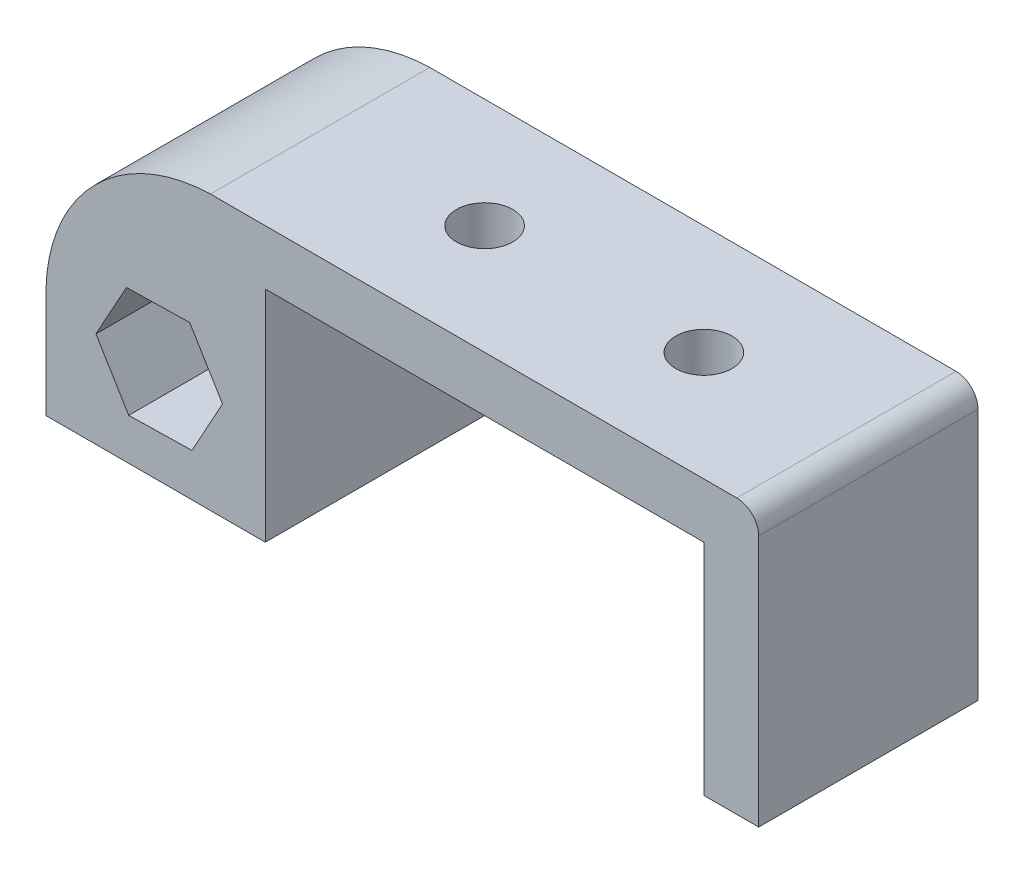
ISO-10303-21;
HEADER;
FILE_DESCRIPTION(('STEP AP214'),'2;1');
FILE_NAME('part.step','',(''),(''),'','','');
FILE_SCHEMA(('AUTOMOTIVE_DESIGN { 1 0 10303 214 1 1 1 1 }'));
ENDSEC;
DATA;
#1=APPLICATION_CONTEXT('core data for automotive mechanical design processes');
#2=APPLICATION_PROTOCOL_DEFINITION('international standard','automotive_design',2000,#1);
#3=PRODUCT_CONTEXT('',#1,'mechanical');
#4=PRODUCT('Part','Part','',(#3));
#5=PRODUCT_RELATED_PRODUCT_CATEGORY('part','',(#4));
#6=PRODUCT_DEFINITION_FORMATION('','',#4);
#7=PRODUCT_DEFINITION_CONTEXT('part definition',#1,'design');
#8=PRODUCT_DEFINITION('design','',#6,#7);
#9=PRODUCT_DEFINITION_SHAPE('','',#8);
#10=(LENGTH_UNIT() NAMED_UNIT(*) SI_UNIT(.MILLI.,.METRE.));
#11=(NAMED_UNIT(*) PLANE_ANGLE_UNIT() SI_UNIT($,.RADIAN.));
#12=(NAMED_UNIT(*) SI_UNIT($,.STERADIAN.) SOLID_ANGLE_UNIT());
#13=UNCERTAINTY_MEASURE_WITH_UNIT(LENGTH_MEASURE(1.E-05),#10,'distance_accuracy_value','');
#14=(GEOMETRIC_REPRESENTATION_CONTEXT(3) GLOBAL_UNCERTAINTY_ASSIGNED_CONTEXT((#13)) GLOBAL_UNIT_ASSIGNED_CONTEXT((#10,
#11,#12)) REPRESENTATION_CONTEXT('',''));
#15=CARTESIAN_POINT('',(0.,0.,0.));
#16=DIRECTION('',(0.,0.,1.));
#17=DIRECTION('',(1.,0.,0.));
#18=AXIS2_PLACEMENT_3D('',#15,#16,#17);
#19=CARTESIAN_POINT('',(-5.84897084048025,12.1989708404802,25.4));
#20=DIRECTION('',(0.,0.,-1.));
#21=DIRECTION('',(-1.,0.,0.));
#22=AXIS2_PLACEMENT_3D('',#19,#20,#21);
#23=PLANE('',#22);
#24=DIRECTION('',(1.,0.,0.));
#25=VECTOR('',#24,1.);
#26=CARTESIAN_POINT('',(0.,0.,25.4));
#27=LINE('',#26,#25);
#28=CARTESIAN_POINT('',(-25.4,0.,25.4));
#29=VERTEX_POINT('',#28);
#30=CARTESIAN_POINT('',(0.,0.,25.4));
#31=VERTEX_POINT('',#30);
#32=EDGE_CURVE('E223',#29,#31,#27,.T.);
#33=ORIENTED_EDGE('',*,*,#32,.T.);
#34=DIRECTION('',(0.,1.,0.));
#35=VECTOR('',#34,1.);
#36=CARTESIAN_POINT('',(0.,0.,25.4));
#37=LINE('',#36,#35);
#38=CARTESIAN_POINT('',(0.,25.4,25.4));
#39=VERTEX_POINT('',#38);
#40=EDGE_CURVE('E227',#31,#39,#37,.T.);
#41=ORIENTED_EDGE('',*,*,#40,.T.);
#42=DIRECTION('',(1.,0.,0.));
#43=VECTOR('',#42,1.);
#44=CARTESIAN_POINT('',(0.,25.4,25.4));
#45=LINE('',#44,#43);
#46=CARTESIAN_POINT('',(50.8,25.4,25.4));
#47=VERTEX_POINT('',#46);
#48=EDGE_CURVE('E231',#39,#47,#45,.T.);
#49=ORIENTED_EDGE('',*,*,#48,.T.);
#50=DIRECTION('',(0.,-1.,0.));
#51=VECTOR('',#50,1.);
#52=CARTESIAN_POINT('',(50.8,0.,25.4));
#53=LINE('',#52,#51);
#54=CARTESIAN_POINT('',(50.8,0.,25.4));
#55=VERTEX_POINT('',#54);
#56=EDGE_CURVE('E234',#47,#55,#53,.T.);
#57=ORIENTED_EDGE('',*,*,#56,.T.);
#58=DIRECTION('',(1.,0.,0.));
#59=VECTOR('',#58,1.);
#60=CARTESIAN_POINT('',(50.8,0.,25.4));
#61=LINE('',#60,#59);
#62=CARTESIAN_POINT('',(57.15,0.,25.4));
#63=VERTEX_POINT('',#62);
#64=EDGE_CURVE('E237',#55,#63,#61,.T.);
#65=ORIENTED_EDGE('',*,*,#64,.T.);
#66=DIRECTION('',(0.,1.,0.));
#67=VECTOR('',#66,1.);
#68=CARTESIAN_POINT('',(57.15,0.,25.4));
#69=LINE('',#68,#67);
#70=CARTESIAN_POINT('',(57.15,29.21,25.4));
#71=VERTEX_POINT('',#70);
#72=EDGE_CURVE('E240',#63,#71,#69,.T.);
#73=ORIENTED_EDGE('',*,*,#72,.T.);
#74=CARTESIAN_POINT('',(54.61,29.21,25.4));
#75=DIRECTION('',(0.,0.,1.));
#76=DIRECTION('',(1.,0.,0.));
#77=AXIS2_PLACEMENT_3D('',#74,#75,#76);
#78=CIRCLE('',#77,2.54);
#79=CARTESIAN_POINT('',(54.61,31.75,25.4));
#80=VERTEX_POINT('',#79);
#81=EDGE_CURVE('E243',#71,#80,#78,.T.);
#82=ORIENTED_EDGE('',*,*,#81,.T.);
#83=DIRECTION('',(-1.,0.,0.));
#84=VECTOR('',#83,1.);
#85=CARTESIAN_POINT('',(54.61,31.75,25.4));
#86=LINE('',#85,#84);
#87=CARTESIAN_POINT('',(-6.35,31.75,25.4));
#88=VERTEX_POINT('',#87);
#89=EDGE_CURVE('E246',#80,#88,#86,.T.);
#90=ORIENTED_EDGE('',*,*,#89,.T.);
#91=CARTESIAN_POINT('',(-5.84897084048025,12.1989708404802,25.4));
#92=DIRECTION('',(0.,0.,1.));
#93=DIRECTION('',(-1.,0.,0.));
#94=AXIS2_PLACEMENT_3D('',#91,#92,#93);
#95=CIRCLE('',#94,19.5574479780743);
#96=CARTESIAN_POINT('',(-25.4,12.7,25.4));
#97=VERTEX_POINT('',#96);
#98=EDGE_CURVE('E249',#88,#97,#95,.T.);
#99=ORIENTED_EDGE('',*,*,#98,.T.);
#100=DIRECTION('',(0.,-1.,0.));
#101=VECTOR('',#100,1.);
#102=CARTESIAN_POINT('',(-25.4,0.,25.4));
#103=LINE('',#102,#101);
#104=EDGE_CURVE('E252',#97,#29,#103,.T.);
#105=ORIENTED_EDGE('',*,*,#104,.T.);
#106=EDGE_LOOP('',(#33,#41,#49,#57,#65,#73,#82,#90,#99,#105));
#107=FACE_BOUND('',#106,.T.);
#108=DIRECTION('',(0.999786141072271,0.0206802350039372,0.));
#109=VECTOR('',#108,1.);
#110=CARTESIAN_POINT('',(-15.8201770194775,4.81602093441883,25.4));
#111=LINE('',#110,#109);
#112=CARTESIAN_POINT('',(-15.8201770194775,4.81602093441883,25.4));
#113=VERTEX_POINT('',#112);
#114=CARTESIAN_POINT('',(-8.48939668893978,4.96765562284847,25.4));
#115=VERTEX_POINT('',#114);
#116=EDGE_CURVE('E152',#113,#115,#111,.T.);
#117=ORIENTED_EDGE('',*,*,#116,.F.);
#118=DIRECTION('',(0.517802679405777,-0.85550007901823,0.));
#119=VECTOR('',#118,1.);
#120=CARTESIAN_POINT('',(-19.6168866770213,11.0888455860129,25.4));
#121=LINE('',#120,#119);
#122=CARTESIAN_POINT('',(-19.6168866770213,11.0888455860129,25.4));
#123=VERTEX_POINT('',#122);
#124=EDGE_CURVE('E188',#123,#113,#121,.T.);
#125=ORIENTED_EDGE('',*,*,#124,.F.);
#126=DIRECTION('',(-0.481983461666493,-0.876180314022167,0.));
#127=VECTOR('',#126,1.);
#128=CARTESIAN_POINT('',(-16.0828160040275,17.5133049260367,25.4));
#129=LINE('',#128,#127);
#130=CARTESIAN_POINT('',(-16.0828160040275,17.5133049260367,25.4));
#131=VERTEX_POINT('',#130);
#132=EDGE_CURVE('E185',#131,#123,#129,.T.);
#133=ORIENTED_EDGE('',*,*,#132,.F.);
#134=DIRECTION('',(-0.99978614107227,-0.0206802350039372,0.));
#135=VECTOR('',#134,1.);
#136=CARTESIAN_POINT('',(-8.75203567348977,17.6649396144663,25.4));
#137=LINE('',#136,#135);
#138=CARTESIAN_POINT('',(-8.75203567348977,17.6649396144663,25.4));
#139=VERTEX_POINT('',#138);
#140=EDGE_CURVE('E179',#139,#131,#137,.T.);
#141=ORIENTED_EDGE('',*,*,#140,.F.);
#142=DIRECTION('',(-0.517802679405777,0.85550007901823,0.));
#143=VECTOR('',#142,1.);
#144=CARTESIAN_POINT('',(-4.95532601594594,11.3921149628722,25.4));
#145=LINE('',#144,#143);
#146=CARTESIAN_POINT('',(-4.95532601594594,11.3921149628722,25.4));
#147=VERTEX_POINT('',#146);
#148=EDGE_CURVE('E175',#147,#139,#145,.T.);
#149=ORIENTED_EDGE('',*,*,#148,.F.);
#150=DIRECTION('',(0.481983461666493,0.876180314022167,0.));
#151=VECTOR('',#150,1.);
#152=CARTESIAN_POINT('',(-8.48939668893978,4.96765562284847,25.4));
#153=LINE('',#152,#151);
#154=EDGE_CURVE('E161',#115,#147,#153,.T.);
#155=ORIENTED_EDGE('',*,*,#154,.F.);
#156=EDGE_LOOP('',(#117,#125,#133,#141,#149,#155));
#157=FACE_BOUND('',#156,.T.);
#158=ADVANCED_FACE('F38',(#107,#157),#23,.F.);
#159=CARTESIAN_POINT('',(-5.84897084048025,12.1989708404802,0.));
#160=DIRECTION('',(0.,0.,-1.));
#161=DIRECTION('',(-1.,0.,0.));
#162=AXIS2_PLACEMENT_3D('',#159,#160,#161);
#163=PLANE('',#162);
#164=DIRECTION('',(1.,0.,0.));
#165=VECTOR('',#164,1.);
#166=CARTESIAN_POINT('',(0.,0.,0.));
#167=LINE('',#166,#165);
#168=CARTESIAN_POINT('',(-25.4,0.,0.));
#169=VERTEX_POINT('',#168);
#170=CARTESIAN_POINT('',(0.,0.,0.));
#171=VERTEX_POINT('',#170);
#172=EDGE_CURVE('E170',#169,#171,#167,.T.);
#173=ORIENTED_EDGE('',*,*,#172,.F.);
#174=DIRECTION('',(0.,-1.,0.));
#175=VECTOR('',#174,1.);
#176=CARTESIAN_POINT('',(-25.4,0.,0.));
#177=LINE('',#176,#175);
#178=CARTESIAN_POINT('',(-25.4,12.7,0.));
#179=VERTEX_POINT('',#178);
#180=EDGE_CURVE('E228',#179,#169,#177,.T.);
#181=ORIENTED_EDGE('',*,*,#180,.F.);
#182=CARTESIAN_POINT('',(-5.84897084048025,12.1989708404802,0.));
#183=DIRECTION('',(0.,0.,1.));
#184=DIRECTION('',(-1.,0.,0.));
#185=AXIS2_PLACEMENT_3D('',#182,#183,#184);
#186=CIRCLE('',#185,19.5574479780743);
#187=CARTESIAN_POINT('',(-6.35,31.75,0.));
#188=VERTEX_POINT('',#187);
#189=EDGE_CURVE('E280',#188,#179,#186,.T.);
#190=ORIENTED_EDGE('',*,*,#189,.F.);
#191=DIRECTION('',(-1.,0.,0.));
#192=VECTOR('',#191,1.);
#193=CARTESIAN_POINT('',(54.61,31.75,0.));
#194=LINE('',#193,#192);
#195=CARTESIAN_POINT('',(54.61,31.75,0.));
#196=VERTEX_POINT('',#195);
#197=EDGE_CURVE('E277',#196,#188,#194,.T.);
#198=ORIENTED_EDGE('',*,*,#197,.F.);
#199=CARTESIAN_POINT('',(54.61,29.21,0.));
#200=DIRECTION('',(0.,0.,1.));
#201=DIRECTION('',(1.,0.,0.));
#202=AXIS2_PLACEMENT_3D('',#199,#200,#201);
#203=CIRCLE('',#202,2.54);
#204=CARTESIAN_POINT('',(57.15,29.21,0.));
#205=VERTEX_POINT('',#204);
#206=EDGE_CURVE('E274',#205,#196,#203,.T.);
#207=ORIENTED_EDGE('',*,*,#206,.F.);
#208=DIRECTION('',(0.,1.,0.));
#209=VECTOR('',#208,1.);
#210=CARTESIAN_POINT('',(57.15,0.,0.));
#211=LINE('',#210,#209);
#212=CARTESIAN_POINT('',(57.15,0.,0.));
#213=VERTEX_POINT('',#212);
#214=EDGE_CURVE('E271',#213,#205,#211,.T.);
#215=ORIENTED_EDGE('',*,*,#214,.F.);
#216=DIRECTION('',(1.,0.,0.));
#217=VECTOR('',#216,1.);
#218=CARTESIAN_POINT('',(50.8,0.,0.));
#219=LINE('',#218,#217);
#220=CARTESIAN_POINT('',(50.8,0.,0.));
#221=VERTEX_POINT('',#220);
#222=EDGE_CURVE('E268',#221,#213,#219,.T.);
#223=ORIENTED_EDGE('',*,*,#222,.F.);
#224=DIRECTION('',(0.,-1.,0.));
#225=VECTOR('',#224,1.);
#226=CARTESIAN_POINT('',(50.8,0.,0.));
#227=LINE('',#226,#225);
#228=CARTESIAN_POINT('',(50.8,25.4,0.));
#229=VERTEX_POINT('',#228);
#230=EDGE_CURVE('E265',#229,#221,#227,.T.);
#231=ORIENTED_EDGE('',*,*,#230,.F.);
#232=DIRECTION('',(1.,0.,0.));
#233=VECTOR('',#232,1.);
#234=CARTESIAN_POINT('',(0.,25.4,0.));
#235=LINE('',#234,#233);
#236=CARTESIAN_POINT('',(0.,25.4,0.));
#237=VERTEX_POINT('',#236);
#238=EDGE_CURVE('E262',#237,#229,#235,.T.);
#239=ORIENTED_EDGE('',*,*,#238,.F.);
#240=DIRECTION('',(0.,1.,0.));
#241=VECTOR('',#240,1.);
#242=CARTESIAN_POINT('',(0.,0.,0.));
#243=LINE('',#242,#241);
#244=EDGE_CURVE('E259',#171,#237,#243,.T.);
#245=ORIENTED_EDGE('',*,*,#244,.F.);
#246=EDGE_LOOP('',(#173,#181,#190,#198,#207,#215,#223,#231,#239,#245));
#247=FACE_BOUND('',#246,.T.);
#248=DIRECTION('',(0.517802679405777,-0.85550007901823,0.));
#249=VECTOR('',#248,1.);
#250=CARTESIAN_POINT('',(-19.6168866770213,11.0888455860129,0.));
#251=LINE('',#250,#249);
#252=CARTESIAN_POINT('',(-19.6168866770213,11.0888455860129,0.));
#253=VERTEX_POINT('',#252);
#254=CARTESIAN_POINT('',(-15.8201770194775,4.81602093441883,0.));
#255=VERTEX_POINT('',#254);
#256=EDGE_CURVE('E162',#253,#255,#251,.T.);
#257=ORIENTED_EDGE('',*,*,#256,.T.);
#258=DIRECTION('',(0.999786141072271,0.0206802350039372,0.));
#259=VECTOR('',#258,1.);
#260=CARTESIAN_POINT('',(-15.8201770194775,4.81602093441883,0.));
#261=LINE('',#260,#259);
#262=CARTESIAN_POINT('',(-8.48939668893978,4.96765562284847,0.));
#263=VERTEX_POINT('',#262);
#264=EDGE_CURVE('E62',#255,#263,#261,.T.);
#265=ORIENTED_EDGE('',*,*,#264,.T.);
#266=DIRECTION('',(0.481983461666493,0.876180314022167,0.));
#267=VECTOR('',#266,1.);
#268=CARTESIAN_POINT('',(-8.48939668893978,4.96765562284847,0.));
#269=LINE('',#268,#267);
#270=CARTESIAN_POINT('',(-4.95532601594594,11.3921149628722,0.));
#271=VERTEX_POINT('',#270);
#272=EDGE_CURVE('E168',#263,#271,#269,.T.);
#273=ORIENTED_EDGE('',*,*,#272,.T.);
#274=DIRECTION('',(-0.517802679405777,0.85550007901823,0.));
#275=VECTOR('',#274,1.);
#276=CARTESIAN_POINT('',(-4.95532601594594,11.3921149628722,0.));
#277=LINE('',#276,#275);
#278=CARTESIAN_POINT('',(-8.75203567348977,17.6649396144663,0.));
#279=VERTEX_POINT('',#278);
#280=EDGE_CURVE('E196',#271,#279,#277,.T.);
#281=ORIENTED_EDGE('',*,*,#280,.T.);
#282=DIRECTION('',(-0.99978614107227,-0.0206802350039372,0.));
#283=VECTOR('',#282,1.);
#284=CARTESIAN_POINT('',(-8.75203567348977,17.6649396144663,0.));
#285=LINE('',#284,#283);
#286=CARTESIAN_POINT('',(-16.0828160040275,17.5133049260367,0.));
#287=VERTEX_POINT('',#286);
#288=EDGE_CURVE('E200',#279,#287,#285,.T.);
#289=ORIENTED_EDGE('',*,*,#288,.T.);
#290=DIRECTION('',(-0.481983461666493,-0.876180314022167,0.));
#291=VECTOR('',#290,1.);
#292=CARTESIAN_POINT('',(-16.0828160040275,17.5133049260367,0.));
#293=LINE('',#292,#291);
#294=EDGE_CURVE('E204',#287,#253,#293,.T.);
#295=ORIENTED_EDGE('',*,*,#294,.T.);
#296=EDGE_LOOP('',(#257,#265,#273,#281,#289,#295));
#297=FACE_BOUND('',#296,.T.);
#298=ADVANCED_FACE('F327',(#247,#297),#163,.T.);
#299=CARTESIAN_POINT('',(0.,0.,25.4));
#300=DIRECTION('',(0.,1.,0.));
#301=DIRECTION('',(-1.,0.,0.));
#302=AXIS2_PLACEMENT_3D('',#299,#300,#301);
#303=PLANE('',#302);
#304=ORIENTED_EDGE('',*,*,#172,.T.);
#305=DIRECTION('',(0.,0.,-1.));
#306=VECTOR('',#305,1.);
#307=CARTESIAN_POINT('',(0.,0.,25.4));
#308=LINE('',#307,#306);
#309=EDGE_CURVE('E11',#31,#171,#308,.T.);
#310=ORIENTED_EDGE('',*,*,#309,.F.);
#311=ORIENTED_EDGE('',*,*,#32,.F.);
#312=DIRECTION('',(0.,0.,-1.));
#313=VECTOR('',#312,1.);
#314=CARTESIAN_POINT('',(-25.4,0.,25.4));
#315=LINE('',#314,#313);
#316=EDGE_CURVE('E255',#29,#169,#315,.T.);
#317=ORIENTED_EDGE('',*,*,#316,.T.);
#318=EDGE_LOOP('',(#304,#310,#311,#317));
#319=FACE_BOUND('',#318,.T.);
#320=ADVANCED_FACE('F40',(#319),#303,.F.);
#321=CARTESIAN_POINT('',(0.,0.,25.4));
#322=DIRECTION('',(-1.,0.,0.));
#323=DIRECTION('',(0.,0.,1.));
#324=AXIS2_PLACEMENT_3D('',#321,#322,#323);
#325=PLANE('',#324);
#326=ORIENTED_EDGE('',*,*,#244,.T.);
#327=DIRECTION('',(0.,0.,-1.));
#328=VECTOR('',#327,1.);
#329=CARTESIAN_POINT('',(0.,25.4,25.4));
#330=LINE('',#329,#328);
#331=EDGE_CURVE('E47',#39,#237,#330,.T.);
#332=ORIENTED_EDGE('',*,*,#331,.F.);
#333=ORIENTED_EDGE('',*,*,#40,.F.);
#334=ORIENTED_EDGE('',*,*,#309,.T.);
#335=EDGE_LOOP('',(#326,#332,#333,#334));
#336=FACE_BOUND('',#335,.T.);
#337=ADVANCED_FACE('F344',(#336),#325,.F.);
#338=CARTESIAN_POINT('',(0.,25.4,25.4));
#339=DIRECTION('',(0.,1.,0.));
#340=DIRECTION('',(0.,0.,1.));
#341=AXIS2_PLACEMENT_3D('',#338,#339,#340);
#342=PLANE('',#341);
#343=CARTESIAN_POINT('',(12.7,25.4,12.7));
#344=DIRECTION('',(0.,1.,0.));
#345=DIRECTION('',(0.,0.,1.));
#346=AXIS2_PLACEMENT_3D('',#343,#344,#345);
#347=CIRCLE('',#346,3.2639);
#348=CARTESIAN_POINT('',(12.7,25.4,15.9639));
#349=VERTEX_POINT('',#348);
#350=EDGE_CURVE('E193',#349,#349,#347,.T.);
#351=ORIENTED_EDGE('',*,*,#350,.T.);
#352=EDGE_LOOP('',(#351));
#353=FACE_BOUND('',#352,.T.);
#354=CARTESIAN_POINT('',(38.1,25.4,12.7));
#355=DIRECTION('',(0.,1.,0.));
#356=DIRECTION('',(0.,0.,1.));
#357=AXIS2_PLACEMENT_3D('',#354,#355,#356);
#358=CIRCLE('',#357,3.26390000000001);
#359=CARTESIAN_POINT('',(38.1,25.4,15.9639));
#360=VERTEX_POINT('',#359);
#361=EDGE_CURVE('E406',#360,#360,#358,.T.);
#362=ORIENTED_EDGE('',*,*,#361,.T.);
#363=EDGE_LOOP('',(#362));
#364=FACE_BOUND('',#363,.T.);
#365=ORIENTED_EDGE('',*,*,#238,.T.);
#366=DIRECTION('',(0.,0.,-1.));
#367=VECTOR('',#366,1.);
#368=CARTESIAN_POINT('',(50.8,25.4,25.4));
#369=LINE('',#368,#367);
#370=EDGE_CURVE('E312',#47,#229,#369,.T.);
#371=ORIENTED_EDGE('',*,*,#370,.F.);
#372=ORIENTED_EDGE('',*,*,#48,.F.);
#373=ORIENTED_EDGE('',*,*,#331,.T.);
#374=EDGE_LOOP('',(#365,#371,#372,#373));
#375=FACE_BOUND('',#374,.T.);
#376=ADVANCED_FACE('F321',(#353,#364,#375),#342,.F.);
#377=CARTESIAN_POINT('',(50.8,0.,25.4));
#378=DIRECTION('',(1.,0.,0.));
#379=DIRECTION('',(0.,0.,-1.));
#380=AXIS2_PLACEMENT_3D('',#377,#378,#379);
#381=PLANE('',#380);
#382=ORIENTED_EDGE('',*,*,#230,.T.);
#383=DIRECTION('',(0.,0.,-1.));
#384=VECTOR('',#383,1.);
#385=CARTESIAN_POINT('',(50.8,0.,25.4));
#386=LINE('',#385,#384);
#387=EDGE_CURVE('E308',#55,#221,#386,.T.);
#388=ORIENTED_EDGE('',*,*,#387,.F.);
#389=ORIENTED_EDGE('',*,*,#56,.F.);
#390=ORIENTED_EDGE('',*,*,#370,.T.);
#391=EDGE_LOOP('',(#382,#388,#389,#390));
#392=FACE_BOUND('',#391,.T.);
#393=ADVANCED_FACE('F333',(#392),#381,.F.);
#394=CARTESIAN_POINT('',(50.8,0.,25.4));
#395=DIRECTION('',(0.,1.,0.));
#396=DIRECTION('',(0.,0.,1.));
#397=AXIS2_PLACEMENT_3D('',#394,#395,#396);
#398=PLANE('',#397);
#399=ORIENTED_EDGE('',*,*,#222,.T.);
#400=DIRECTION('',(0.,0.,-1.));
#401=VECTOR('',#400,1.);
#402=CARTESIAN_POINT('',(57.15,0.,25.4));
#403=LINE('',#402,#401);
#404=EDGE_CURVE('E304',#63,#213,#403,.T.);
#405=ORIENTED_EDGE('',*,*,#404,.F.);
#406=ORIENTED_EDGE('',*,*,#64,.F.);
#407=ORIENTED_EDGE('',*,*,#387,.T.);
#408=EDGE_LOOP('',(#399,#405,#406,#407));
#409=FACE_BOUND('',#408,.T.);
#410=ADVANCED_FACE('F337',(#409),#398,.F.);
#411=CARTESIAN_POINT('',(57.15,0.,25.4));
#412=DIRECTION('',(-1.,0.,0.));
#413=DIRECTION('',(0.,0.,1.));
#414=AXIS2_PLACEMENT_3D('',#411,#412,#413);
#415=PLANE('',#414);
#416=ORIENTED_EDGE('',*,*,#214,.T.);
#417=DIRECTION('',(0.,0.,-1.));
#418=VECTOR('',#417,1.);
#419=CARTESIAN_POINT('',(57.15,29.21,25.4));
#420=LINE('',#419,#418);
#421=EDGE_CURVE('E300',#71,#205,#420,.T.);
#422=ORIENTED_EDGE('',*,*,#421,.F.);
#423=ORIENTED_EDGE('',*,*,#72,.F.);
#424=ORIENTED_EDGE('',*,*,#404,.T.);
#425=EDGE_LOOP('',(#416,#422,#423,#424));
#426=FACE_BOUND('',#425,.T.);
#427=ADVANCED_FACE('F367',(#426),#415,.F.);
#428=CARTESIAN_POINT('',(54.61,29.21,25.4));
#429=DIRECTION('',(0.,0.,-1.));
#430=DIRECTION('',(-1.,0.,0.));
#431=AXIS2_PLACEMENT_3D('',#428,#429,#430);
#432=CYLINDRICAL_SURFACE('',#431,2.54);
#433=ORIENTED_EDGE('',*,*,#206,.T.);
#434=DIRECTION('',(0.,0.,-1.));
#435=VECTOR('',#434,1.);
#436=CARTESIAN_POINT('',(54.61,31.75,25.4));
#437=LINE('',#436,#435);
#438=EDGE_CURVE('E296',#80,#196,#437,.T.);
#439=ORIENTED_EDGE('',*,*,#438,.F.);
#440=ORIENTED_EDGE('',*,*,#81,.F.);
#441=ORIENTED_EDGE('',*,*,#421,.T.);
#442=EDGE_LOOP('',(#433,#439,#440,#441));
#443=FACE_BOUND('',#442,.T.);
#444=ADVANCED_FACE('F364',(#443),#432,.T.);
#445=CARTESIAN_POINT('',(54.61,31.75,25.4));
#446=DIRECTION('',(0.,-1.,0.));
#447=DIRECTION('',(1.,0.,0.));
#448=AXIS2_PLACEMENT_3D('',#445,#446,#447);
#449=PLANE('',#448);
#450=CARTESIAN_POINT('',(12.7,31.75,12.7));
#451=DIRECTION('',(0.,1.,0.));
#452=DIRECTION('',(-1.,0.,0.));
#453=AXIS2_PLACEMENT_3D('',#450,#451,#452);
#454=CIRCLE('',#453,3.2639);
#455=CARTESIAN_POINT('',(9.43609999999999,31.75,12.7));
#456=VERTEX_POINT('',#455);
#457=EDGE_CURVE('E398',#456,#456,#454,.T.);
#458=ORIENTED_EDGE('',*,*,#457,.F.);
#459=EDGE_LOOP('',(#458));
#460=FACE_BOUND('',#459,.T.);
#461=CARTESIAN_POINT('',(38.1,31.75,12.7));
#462=DIRECTION('',(0.,1.,0.));
#463=DIRECTION('',(1.,0.,0.));
#464=AXIS2_PLACEMENT_3D('',#461,#462,#463);
#465=CIRCLE('',#464,3.26390000000001);
#466=CARTESIAN_POINT('',(41.3639,31.75,12.7));
#467=VERTEX_POINT('',#466);
#468=EDGE_CURVE('E401',#467,#467,#465,.T.);
#469=ORIENTED_EDGE('',*,*,#468,.F.);
#470=EDGE_LOOP('',(#469));
#471=FACE_BOUND('',#470,.T.);
#472=ORIENTED_EDGE('',*,*,#197,.T.);
#473=DIRECTION('',(0.,0.,-1.));
#474=VECTOR('',#473,1.);
#475=CARTESIAN_POINT('',(-6.35,31.75,25.4));
#476=LINE('',#475,#474);
#477=EDGE_CURVE('E292',#88,#188,#476,.T.);
#478=ORIENTED_EDGE('',*,*,#477,.F.);
#479=ORIENTED_EDGE('',*,*,#89,.F.);
#480=ORIENTED_EDGE('',*,*,#438,.T.);
#481=EDGE_LOOP('',(#472,#478,#479,#480));
#482=FACE_BOUND('',#481,.T.);
#483=ADVANCED_FACE('F360',(#460,#471,#482),#449,.F.);
#484=CARTESIAN_POINT('',(-5.84897084048025,12.1989708404802,25.4));
#485=DIRECTION('',(0.,0.,-1.));
#486=DIRECTION('',(-1.,0.,0.));
#487=AXIS2_PLACEMENT_3D('',#484,#485,#486);
#488=CYLINDRICAL_SURFACE('',#487,19.5574479780743);
#489=ORIENTED_EDGE('',*,*,#189,.T.);
#490=DIRECTION('',(0.,0.,-1.));
#491=VECTOR('',#490,1.);
#492=CARTESIAN_POINT('',(-25.4,12.7,25.4));
#493=LINE('',#492,#491);
#494=EDGE_CURVE('E288',#97,#179,#493,.T.);
#495=ORIENTED_EDGE('',*,*,#494,.F.);
#496=ORIENTED_EDGE('',*,*,#98,.F.);
#497=ORIENTED_EDGE('',*,*,#477,.T.);
#498=EDGE_LOOP('',(#489,#495,#496,#497));
#499=FACE_BOUND('',#498,.T.);
#500=ADVANCED_FACE('F356',(#499),#488,.T.);
#501=CARTESIAN_POINT('',(-25.4,0.,25.4));
#502=DIRECTION('',(1.,0.,0.));
#503=DIRECTION('',(0.,0.,-1.));
#504=AXIS2_PLACEMENT_3D('',#501,#502,#503);
#505=PLANE('',#504);
#506=ORIENTED_EDGE('',*,*,#180,.T.);
#507=ORIENTED_EDGE('',*,*,#316,.F.);
#508=ORIENTED_EDGE('',*,*,#104,.F.);
#509=ORIENTED_EDGE('',*,*,#494,.T.);
#510=EDGE_LOOP('',(#506,#507,#508,#509));
#511=FACE_BOUND('',#510,.T.);
#512=ADVANCED_FACE('F351',(#511),#505,.F.);
#513=CARTESIAN_POINT('',(-15.8201770194775,4.81602093441883,25.4));
#514=DIRECTION('',(-0.0206802350039372,0.99978614107227,0.));
#515=DIRECTION('',(-0.99978614107227,-0.0206802350039372,0.));
#516=AXIS2_PLACEMENT_3D('',#513,#514,#515);
#517=PLANE('',#516);
#518=ORIENTED_EDGE('',*,*,#264,.F.);
#519=DIRECTION('',(0.,0.,-1.));
#520=VECTOR('',#519,1.);
#521=CARTESIAN_POINT('',(-15.8201770194775,4.81602093441883,25.4));
#522=LINE('',#521,#520);
#523=EDGE_CURVE('E156',#113,#255,#522,.T.);
#524=ORIENTED_EDGE('',*,*,#523,.F.);
#525=ORIENTED_EDGE('',*,*,#116,.T.);
#526=DIRECTION('',(0.,0.,-1.));
#527=VECTOR('',#526,1.);
#528=CARTESIAN_POINT('',(-8.48939668893978,4.96765562284847,25.4));
#529=LINE('',#528,#527);
#530=EDGE_CURVE('E155',#115,#263,#529,.T.);
#531=ORIENTED_EDGE('',*,*,#530,.T.);
#532=EDGE_LOOP('',(#518,#524,#525,#531));
#533=FACE_BOUND('',#532,.T.);
#534=ADVANCED_FACE('F154',(#533),#517,.T.);
#535=CARTESIAN_POINT('',(-8.48939668893978,4.96765562284847,25.4));
#536=DIRECTION('',(-0.876180314022167,0.481983461666493,0.));
#537=DIRECTION('',(-0.481983461666493,-0.876180314022168,0.));
#538=AXIS2_PLACEMENT_3D('',#535,#536,#537);
#539=PLANE('',#538);
#540=ORIENTED_EDGE('',*,*,#272,.F.);
#541=ORIENTED_EDGE('',*,*,#530,.F.);
#542=ORIENTED_EDGE('',*,*,#154,.T.);
#543=DIRECTION('',(0.,0.,-1.));
#544=VECTOR('',#543,1.);
#545=CARTESIAN_POINT('',(-4.95532601594594,11.3921149628722,25.4));
#546=LINE('',#545,#544);
#547=EDGE_CURVE('E171',#147,#271,#546,.T.);
#548=ORIENTED_EDGE('',*,*,#547,.T.);
#549=EDGE_LOOP('',(#540,#541,#542,#548));
#550=FACE_BOUND('',#549,.T.);
#551=ADVANCED_FACE('F165',(#550),#539,.T.);
#552=CARTESIAN_POINT('',(-4.95532601594594,11.3921149628722,25.4));
#553=DIRECTION('',(-0.85550007901823,-0.517802679405777,0.));
#554=DIRECTION('',(0.517802679405777,-0.85550007901823,0.));
#555=AXIS2_PLACEMENT_3D('',#552,#553,#554);
#556=PLANE('',#555);
#557=ORIENTED_EDGE('',*,*,#280,.F.);
#558=ORIENTED_EDGE('',*,*,#547,.F.);
#559=ORIENTED_EDGE('',*,*,#148,.T.);
#560=DIRECTION('',(0.,0.,-1.));
#561=VECTOR('',#560,1.);
#562=CARTESIAN_POINT('',(-8.75203567348977,17.6649396144663,25.4));
#563=LINE('',#562,#561);
#564=EDGE_CURVE('E218',#139,#279,#563,.T.);
#565=ORIENTED_EDGE('',*,*,#564,.T.);
#566=EDGE_LOOP('',(#557,#558,#559,#565));
#567=FACE_BOUND('',#566,.T.);
#568=ADVANCED_FACE('F437',(#567),#556,.T.);
#569=CARTESIAN_POINT('',(-8.75203567348977,17.6649396144663,25.4));
#570=DIRECTION('',(0.0206802350039372,-0.99978614107227,0.));
#571=DIRECTION('',(0.99978614107227,0.0206802350039372,0.));
#572=AXIS2_PLACEMENT_3D('',#569,#570,#571);
#573=PLANE('',#572);
#574=ORIENTED_EDGE('',*,*,#288,.F.);
#575=ORIENTED_EDGE('',*,*,#564,.F.);
#576=ORIENTED_EDGE('',*,*,#140,.T.);
#577=DIRECTION('',(0.,0.,-1.));
#578=VECTOR('',#577,1.);
#579=CARTESIAN_POINT('',(-16.0828160040275,17.5133049260367,25.4));
#580=LINE('',#579,#578);
#581=EDGE_CURVE('E215',#131,#287,#580,.T.);
#582=ORIENTED_EDGE('',*,*,#581,.T.);
#583=EDGE_LOOP('',(#574,#575,#576,#582));
#584=FACE_BOUND('',#583,.T.);
#585=ADVANCED_FACE('F433',(#584),#573,.T.);
#586=CARTESIAN_POINT('',(-16.0828160040275,17.5133049260367,25.4));
#587=DIRECTION('',(0.876180314022167,-0.481983461666493,0.));
#588=DIRECTION('',(0.481983461666493,0.876180314022168,0.));
#589=AXIS2_PLACEMENT_3D('',#586,#587,#588);
#590=PLANE('',#589);
#591=ORIENTED_EDGE('',*,*,#294,.F.);
#592=ORIENTED_EDGE('',*,*,#581,.F.);
#593=ORIENTED_EDGE('',*,*,#132,.T.);
#594=DIRECTION('',(0.,0.,-1.));
#595=VECTOR('',#594,1.);
#596=CARTESIAN_POINT('',(-19.6168866770213,11.0888455860129,25.4));
#597=LINE('',#596,#595);
#598=EDGE_CURVE('E54',#123,#253,#597,.T.);
#599=ORIENTED_EDGE('',*,*,#598,.T.);
#600=EDGE_LOOP('',(#591,#592,#593,#599));
#601=FACE_BOUND('',#600,.T.);
#602=ADVANCED_FACE('F430',(#601),#590,.T.);
#603=CARTESIAN_POINT('',(-19.6168866770213,11.0888455860129,25.4));
#604=DIRECTION('',(0.85550007901823,0.517802679405777,0.));
#605=DIRECTION('',(-0.517802679405777,0.85550007901823,0.));
#606=AXIS2_PLACEMENT_3D('',#603,#604,#605);
#607=PLANE('',#606);
#608=ORIENTED_EDGE('',*,*,#256,.F.);
#609=ORIENTED_EDGE('',*,*,#598,.F.);
#610=ORIENTED_EDGE('',*,*,#124,.T.);
#611=ORIENTED_EDGE('',*,*,#523,.T.);
#612=EDGE_LOOP('',(#608,#609,#610,#611));
#613=FACE_BOUND('',#612,.T.);
#614=ADVANCED_FACE('F425',(#613),#607,.T.);
#615=CARTESIAN_POINT('',(38.1,0.,12.7));
#616=DIRECTION('',(0.,1.,0.));
#617=DIRECTION('',(-1.,0.,0.));
#618=AXIS2_PLACEMENT_3D('',#615,#616,#617);
#619=CYLINDRICAL_SURFACE('',#618,3.26390000000001);
#620=ORIENTED_EDGE('',*,*,#468,.T.);
#621=EDGE_LOOP('',(#620));
#622=FACE_BOUND('',#621,.T.);
#623=ORIENTED_EDGE('',*,*,#361,.F.);
#624=EDGE_LOOP('',(#623));
#625=FACE_BOUND('',#624,.T.);
#626=ADVANCED_FACE('F419',(#622,#625),#619,.F.);
#627=CARTESIAN_POINT('',(12.7,0.,12.7));
#628=DIRECTION('',(0.,1.,0.));
#629=DIRECTION('',(-1.,0.,0.));
#630=AXIS2_PLACEMENT_3D('',#627,#628,#629);
#631=CYLINDRICAL_SURFACE('',#630,3.2639);
#632=ORIENTED_EDGE('',*,*,#457,.T.);
#633=EDGE_LOOP('',(#632));
#634=FACE_BOUND('',#633,.T.);
#635=ORIENTED_EDGE('',*,*,#350,.F.);
#636=EDGE_LOOP('',(#635));
#637=FACE_BOUND('',#636,.T.);
#638=ADVANCED_FACE('F417',(#634,#637),#631,.F.);
#639=CLOSED_SHELL('',(#158,#298,#320,#337,#376,#393,#410,#427,#444,#483,#500,#512,#534,#551,
#568,#585,#602,#614,#626,#638));
#640=MANIFOLD_SOLID_BREP('B2',#639);
#641=ADVANCED_BREP_SHAPE_REPRESENTATION('',(#18,#640),#14);
#642=SHAPE_DEFINITION_REPRESENTATION(#9,#641);
ENDSEC;
END-ISO-10303-21;
